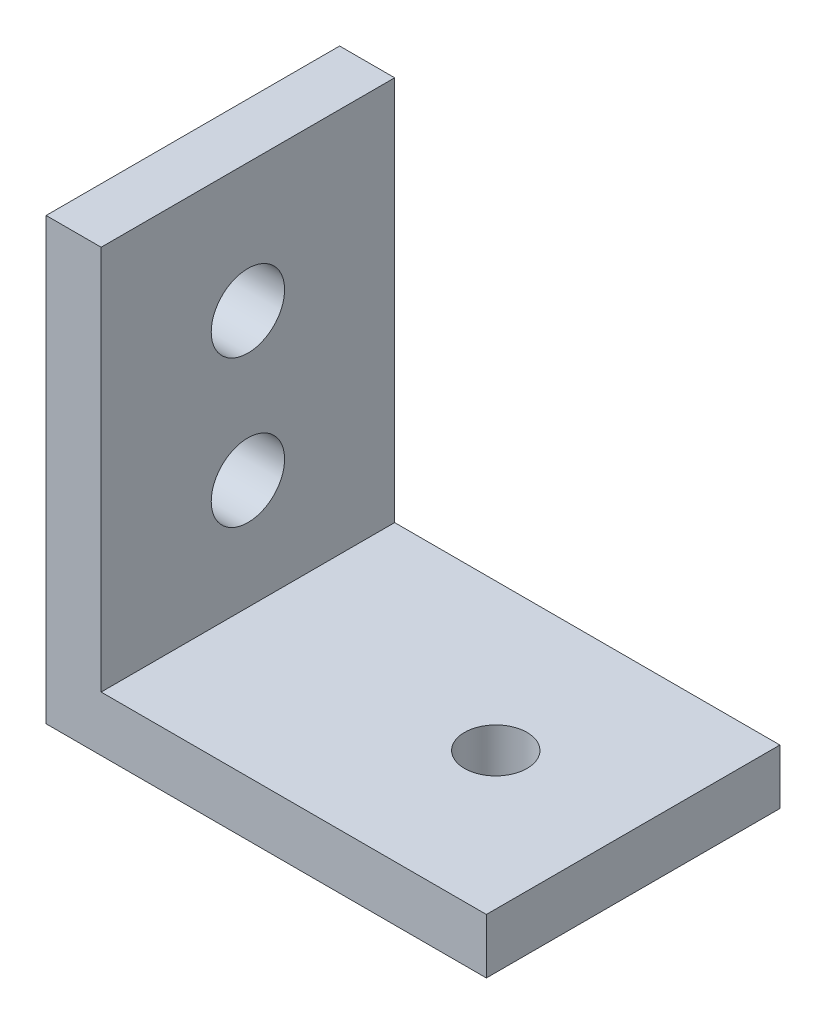
ISO-10303-21;
HEADER;
FILE_DESCRIPTION(('STEP AP214'),'2;1');
FILE_NAME('part.step','',(''),(''),'','','');
FILE_SCHEMA(('AUTOMOTIVE_DESIGN { 1 0 10303 214 1 1 1 1 }'));
ENDSEC;
DATA;
#1=APPLICATION_CONTEXT('core data for automotive mechanical design processes');
#2=APPLICATION_PROTOCOL_DEFINITION('international standard','automotive_design',2000,#1);
#3=PRODUCT_CONTEXT('',#1,'mechanical');
#4=PRODUCT('Part','Part','',(#3));
#5=PRODUCT_RELATED_PRODUCT_CATEGORY('part','',(#4));
#6=PRODUCT_DEFINITION_FORMATION('','',#4);
#7=PRODUCT_DEFINITION_CONTEXT('part definition',#1,'design');
#8=PRODUCT_DEFINITION('design','',#6,#7);
#9=PRODUCT_DEFINITION_SHAPE('','',#8);
#10=(LENGTH_UNIT() NAMED_UNIT(*) SI_UNIT(.MILLI.,.METRE.));
#11=(NAMED_UNIT(*) PLANE_ANGLE_UNIT() SI_UNIT($,.RADIAN.));
#12=(NAMED_UNIT(*) SI_UNIT($,.STERADIAN.) SOLID_ANGLE_UNIT());
#13=UNCERTAINTY_MEASURE_WITH_UNIT(LENGTH_MEASURE(1.E-05),#10,'distance_accuracy_value','');
#14=(GEOMETRIC_REPRESENTATION_CONTEXT(3) GLOBAL_UNCERTAINTY_ASSIGNED_CONTEXT((#13)) GLOBAL_UNIT_ASSIGNED_CONTEXT((#10,
#11,#12)) REPRESENTATION_CONTEXT('',''));
#15=CARTESIAN_POINT('',(0.,0.,0.));
#16=DIRECTION('',(0.,0.,1.));
#17=DIRECTION('',(1.,0.,0.));
#18=AXIS2_PLACEMENT_3D('',#15,#16,#17);
#19=CARTESIAN_POINT('',(-23.7711210122605,18.9432730665901,25.4));
#20=DIRECTION('',(0.,-1.,0.));
#21=DIRECTION('',(0.,0.,-1.));
#22=AXIS2_PLACEMENT_3D('',#19,#20,#21);
#23=PLANE('',#22);
#24=DIRECTION('',(-1.,0.,0.));
#25=VECTOR('',#24,1.);
#26=CARTESIAN_POINT('',(-23.7711210122605,18.9432730665901,0.));
#27=LINE('',#26,#25);
#28=CARTESIAN_POINT('',(-19.0086210122605,18.9432730665901,0.));
#29=VERTEX_POINT('',#28);
#30=CARTESIAN_POINT('',(-23.7711210122605,18.9432730665901,0.));
#31=VERTEX_POINT('',#30);
#32=EDGE_CURVE('E119',#29,#31,#27,.T.);
#33=ORIENTED_EDGE('',*,*,#32,.T.);
#34=DIRECTION('',(0.,0.,-1.));
#35=VECTOR('',#34,1.);
#36=CARTESIAN_POINT('',(-23.7711210122605,18.9432730665901,25.4));
#37=LINE('',#36,#35);
#38=CARTESIAN_POINT('',(-23.7711210122605,18.9432730665901,25.4));
#39=VERTEX_POINT('',#38);
#40=EDGE_CURVE('E11',#39,#31,#37,.T.);
#41=ORIENTED_EDGE('',*,*,#40,.F.);
#42=DIRECTION('',(-1.,0.,0.));
#43=VECTOR('',#42,1.);
#44=CARTESIAN_POINT('',(-23.7711210122605,18.9432730665901,25.4));
#45=LINE('',#44,#43);
#46=CARTESIAN_POINT('',(-19.0086210122605,18.9432730665901,25.4));
#47=VERTEX_POINT('',#46);
#48=EDGE_CURVE('E130',#47,#39,#45,.T.);
#49=ORIENTED_EDGE('',*,*,#48,.F.);
#50=DIRECTION('',(0.,0.,-1.));
#51=VECTOR('',#50,1.);
#52=CARTESIAN_POINT('',(-19.0086210122605,18.9432730665901,25.4));
#53=LINE('',#52,#51);
#54=EDGE_CURVE('E115',#47,#29,#53,.T.);
#55=ORIENTED_EDGE('',*,*,#54,.T.);
#56=EDGE_LOOP('',(#33,#41,#49,#55));
#57=FACE_BOUND('',#56,.T.);
#58=ADVANCED_FACE('F35',(#57),#23,.F.);
#59=CARTESIAN_POINT('',(-23.7711210122605,18.9432730665901,25.4));
#60=DIRECTION('',(1.,0.,0.));
#61=DIRECTION('',(0.,1.,0.));
#62=AXIS2_PLACEMENT_3D('',#59,#60,#61);
#63=PLANE('',#62);
#64=CARTESIAN_POINT('',(-23.7711210122605,-4.86922693340992,12.7));
#65=DIRECTION('',(-1.,0.,0.));
#66=DIRECTION('',(0.,-1.,0.));
#67=AXIS2_PLACEMENT_3D('',#64,#65,#66);
#68=CIRCLE('',#67,3.175);
#69=CARTESIAN_POINT('',(-23.7711210122605,-8.04422693340992,12.7));
#70=VERTEX_POINT('',#69);
#71=EDGE_CURVE('E242',#70,#70,#68,.T.);
#72=ORIENTED_EDGE('',*,*,#71,.F.);
#73=EDGE_LOOP('',(#72));
#74=FACE_BOUND('',#73,.T.);
#75=CARTESIAN_POINT('',(-23.7711210122605,7.83077306659008,12.7));
#76=DIRECTION('',(-1.,0.,0.));
#77=DIRECTION('',(0.,-1.,0.));
#78=AXIS2_PLACEMENT_3D('',#75,#76,#77);
#79=CIRCLE('',#78,3.175);
#80=CARTESIAN_POINT('',(-23.7711210122605,4.65577306659007,12.7));
#81=VERTEX_POINT('',#80);
#82=EDGE_CURVE('E250',#81,#81,#79,.T.);
#83=ORIENTED_EDGE('',*,*,#82,.F.);
#84=EDGE_LOOP('',(#83));
#85=FACE_BOUND('',#84,.T.);
#86=DIRECTION('',(0.,-1.,0.));
#87=VECTOR('',#86,1.);
#88=CARTESIAN_POINT('',(-23.7711210122605,18.9432730665901,0.));
#89=LINE('',#88,#87);
#90=CARTESIAN_POINT('',(-23.7711210122605,-19.1567269334099,0.));
#91=VERTEX_POINT('',#90);
#92=EDGE_CURVE('E122',#31,#91,#89,.T.);
#93=ORIENTED_EDGE('',*,*,#92,.T.);
#94=DIRECTION('',(0.,0.,-1.));
#95=VECTOR('',#94,1.);
#96=CARTESIAN_POINT('',(-23.7711210122605,-19.1567269334099,25.4));
#97=LINE('',#96,#95);
#98=CARTESIAN_POINT('',(-23.7711210122605,-19.1567269334099,25.4));
#99=VERTEX_POINT('',#98);
#100=EDGE_CURVE('E43',#99,#91,#97,.T.);
#101=ORIENTED_EDGE('',*,*,#100,.F.);
#102=DIRECTION('',(0.,-1.,0.));
#103=VECTOR('',#102,1.);
#104=CARTESIAN_POINT('',(-23.7711210122605,18.9432730665901,25.4));
#105=LINE('',#104,#103);
#106=EDGE_CURVE('E88',#39,#99,#105,.T.);
#107=ORIENTED_EDGE('',*,*,#106,.F.);
#108=ORIENTED_EDGE('',*,*,#40,.T.);
#109=EDGE_LOOP('',(#93,#101,#107,#108));
#110=FACE_BOUND('',#109,.T.);
#111=ADVANCED_FACE('F160',(#74,#85,#110),#63,.F.);
#112=CARTESIAN_POINT('',(-23.7711210122605,-19.1567269334099,25.4));
#113=DIRECTION('',(0.,1.,0.));
#114=DIRECTION('',(0.,0.,1.));
#115=AXIS2_PLACEMENT_3D('',#112,#113,#114);
#116=PLANE('',#115);
#117=CARTESIAN_POINT('',(2.44167898773952,-19.1567269334099,12.7));
#118=DIRECTION('',(0.,-1.,0.));
#119=DIRECTION('',(0.,0.,-1.));
#120=AXIS2_PLACEMENT_3D('',#117,#118,#119);
#121=CIRCLE('',#120,2.7051);
#122=CARTESIAN_POINT('',(2.44167898773952,-19.1567269334099,9.9949));
#123=VERTEX_POINT('',#122);
#124=EDGE_CURVE('E240',#123,#123,#121,.T.);
#125=ORIENTED_EDGE('',*,*,#124,.F.);
#126=EDGE_LOOP('',(#125));
#127=FACE_BOUND('',#126,.T.);
#128=DIRECTION('',(1.,0.,0.));
#129=VECTOR('',#128,1.);
#130=CARTESIAN_POINT('',(-23.7711210122605,-19.1567269334099,0.));
#131=LINE('',#130,#129);
#132=CARTESIAN_POINT('',(14.3288789877395,-19.1567269334099,0.));
#133=VERTEX_POINT('',#132);
#134=EDGE_CURVE('E125',#91,#133,#131,.T.);
#135=ORIENTED_EDGE('',*,*,#134,.T.);
#136=DIRECTION('',(0.,0.,-1.));
#137=VECTOR('',#136,1.);
#138=CARTESIAN_POINT('',(14.3288789877395,-19.1567269334099,25.4));
#139=LINE('',#138,#137);
#140=CARTESIAN_POINT('',(14.3288789877395,-19.1567269334099,25.4));
#141=VERTEX_POINT('',#140);
#142=EDGE_CURVE('E110',#141,#133,#139,.T.);
#143=ORIENTED_EDGE('',*,*,#142,.F.);
#144=DIRECTION('',(1.,0.,0.));
#145=VECTOR('',#144,1.);
#146=CARTESIAN_POINT('',(-23.7711210122605,-19.1567269334099,25.4));
#147=LINE('',#146,#145);
#148=EDGE_CURVE('E101',#99,#141,#147,.T.);
#149=ORIENTED_EDGE('',*,*,#148,.F.);
#150=ORIENTED_EDGE('',*,*,#100,.T.);
#151=EDGE_LOOP('',(#135,#143,#149,#150));
#152=FACE_BOUND('',#151,.T.);
#153=ADVANCED_FACE('F136',(#127,#152),#116,.F.);
#154=CARTESIAN_POINT('',(14.3288789877395,-14.3942269334099,25.4));
#155=DIRECTION('',(-1.,0.,0.));
#156=DIRECTION('',(0.,0.,1.));
#157=AXIS2_PLACEMENT_3D('',#154,#155,#156);
#158=PLANE('',#157);
#159=DIRECTION('',(0.,1.,0.));
#160=VECTOR('',#159,1.);
#161=CARTESIAN_POINT('',(14.3288789877395,-14.3942269334099,0.));
#162=LINE('',#161,#160);
#163=CARTESIAN_POINT('',(14.3288789877395,-14.3942269334099,0.));
#164=VERTEX_POINT('',#163);
#165=EDGE_CURVE('E109',#133,#164,#162,.T.);
#166=ORIENTED_EDGE('',*,*,#165,.T.);
#167=DIRECTION('',(0.,0.,-1.));
#168=VECTOR('',#167,1.);
#169=CARTESIAN_POINT('',(14.3288789877395,-14.3942269334099,25.4));
#170=LINE('',#169,#168);
#171=CARTESIAN_POINT('',(14.3288789877395,-14.3942269334099,25.4));
#172=VERTEX_POINT('',#171);
#173=EDGE_CURVE('E106',#172,#164,#170,.T.);
#174=ORIENTED_EDGE('',*,*,#173,.F.);
#175=DIRECTION('',(0.,1.,0.));
#176=VECTOR('',#175,1.);
#177=CARTESIAN_POINT('',(14.3288789877395,-14.3942269334099,25.4));
#178=LINE('',#177,#176);
#179=EDGE_CURVE('E95',#141,#172,#178,.T.);
#180=ORIENTED_EDGE('',*,*,#179,.F.);
#181=ORIENTED_EDGE('',*,*,#142,.T.);
#182=EDGE_LOOP('',(#166,#174,#180,#181));
#183=FACE_BOUND('',#182,.T.);
#184=ADVANCED_FACE('F107',(#183),#158,.F.);
#185=CARTESIAN_POINT('',(-19.0086210122605,-14.3942269334099,25.4));
#186=DIRECTION('',(0.,-1.,0.));
#187=DIRECTION('',(0.,0.,-1.));
#188=AXIS2_PLACEMENT_3D('',#185,#186,#187);
#189=PLANE('',#188);
#190=CARTESIAN_POINT('',(2.44167898773952,-14.3942269334099,12.7));
#191=DIRECTION('',(0.,-1.,0.));
#192=DIRECTION('',(0.,0.,-1.));
#193=AXIS2_PLACEMENT_3D('',#190,#191,#192);
#194=CIRCLE('',#193,2.7051);
#195=CARTESIAN_POINT('',(2.44167898773952,-14.3942269334099,9.9949));
#196=VERTEX_POINT('',#195);
#197=EDGE_CURVE('E237',#196,#196,#194,.T.);
#198=ORIENTED_EDGE('',*,*,#197,.T.);
#199=EDGE_LOOP('',(#198));
#200=FACE_BOUND('',#199,.T.);
#201=DIRECTION('',(-1.,0.,0.));
#202=VECTOR('',#201,1.);
#203=CARTESIAN_POINT('',(-19.0086210122605,-14.3942269334099,0.));
#204=LINE('',#203,#202);
#205=CARTESIAN_POINT('',(-19.0086210122605,-14.3942269334099,0.));
#206=VERTEX_POINT('',#205);
#207=EDGE_CURVE('E74',#164,#206,#204,.T.);
#208=ORIENTED_EDGE('',*,*,#207,.T.);
#209=DIRECTION('',(0.,0.,-1.));
#210=VECTOR('',#209,1.);
#211=CARTESIAN_POINT('',(-19.0086210122605,-14.3942269334099,25.4));
#212=LINE('',#211,#210);
#213=CARTESIAN_POINT('',(-19.0086210122605,-14.3942269334099,25.4));
#214=VERTEX_POINT('',#213);
#215=EDGE_CURVE('E111',#214,#206,#212,.T.);
#216=ORIENTED_EDGE('',*,*,#215,.F.);
#217=DIRECTION('',(-1.,0.,0.));
#218=VECTOR('',#217,1.);
#219=CARTESIAN_POINT('',(-19.0086210122605,-14.3942269334099,25.4));
#220=LINE('',#219,#218);
#221=EDGE_CURVE('E99',#172,#214,#220,.T.);
#222=ORIENTED_EDGE('',*,*,#221,.F.);
#223=ORIENTED_EDGE('',*,*,#173,.T.);
#224=EDGE_LOOP('',(#208,#216,#222,#223));
#225=FACE_BOUND('',#224,.T.);
#226=ADVANCED_FACE('F113',(#200,#225),#189,.F.);
#227=CARTESIAN_POINT('',(-19.0086210122605,18.9432730665901,25.4));
#228=DIRECTION('',(-1.,0.,0.));
#229=DIRECTION('',(0.,0.,1.));
#230=AXIS2_PLACEMENT_3D('',#227,#228,#229);
#231=PLANE('',#230);
#232=CARTESIAN_POINT('',(-19.0086210122605,-4.86922693340992,12.7));
#233=DIRECTION('',(-1.,0.,0.));
#234=DIRECTION('',(0.,0.,1.));
#235=AXIS2_PLACEMENT_3D('',#232,#233,#234);
#236=CIRCLE('',#235,3.175);
#237=CARTESIAN_POINT('',(-19.0086210122605,-4.86922693340992,15.875));
#238=VERTEX_POINT('',#237);
#239=EDGE_CURVE('E247',#238,#238,#236,.F.);
#240=ORIENTED_EDGE('',*,*,#239,.F.);
#241=EDGE_LOOP('',(#240));
#242=FACE_BOUND('',#241,.T.);
#243=CARTESIAN_POINT('',(-19.0086210122605,7.83077306659008,12.7));
#244=DIRECTION('',(-1.,0.,0.));
#245=DIRECTION('',(0.,0.,1.));
#246=AXIS2_PLACEMENT_3D('',#243,#244,#245);
#247=CIRCLE('',#246,3.175);
#248=CARTESIAN_POINT('',(-19.0086210122605,7.83077306659008,15.875));
#249=VERTEX_POINT('',#248);
#250=EDGE_CURVE('E123',#249,#249,#247,.F.);
#251=ORIENTED_EDGE('',*,*,#250,.F.);
#252=EDGE_LOOP('',(#251));
#253=FACE_BOUND('',#252,.T.);
#254=DIRECTION('',(0.,1.,0.));
#255=VECTOR('',#254,1.);
#256=CARTESIAN_POINT('',(-19.0086210122605,18.9432730665901,0.));
#257=LINE('',#256,#255);
#258=EDGE_CURVE('E80',#206,#29,#257,.T.);
#259=ORIENTED_EDGE('',*,*,#258,.T.);
#260=ORIENTED_EDGE('',*,*,#54,.F.);
#261=DIRECTION('',(0.,1.,0.));
#262=VECTOR('',#261,1.);
#263=CARTESIAN_POINT('',(-19.0086210122605,18.9432730665901,25.4));
#264=LINE('',#263,#262);
#265=EDGE_CURVE('E51',#214,#47,#264,.T.);
#266=ORIENTED_EDGE('',*,*,#265,.F.);
#267=ORIENTED_EDGE('',*,*,#215,.T.);
#268=EDGE_LOOP('',(#259,#260,#266,#267));
#269=FACE_BOUND('',#268,.T.);
#270=ADVANCED_FACE('F143',(#242,#253,#269),#231,.F.);
#271=CARTESIAN_POINT('',(0.,0.,25.4));
#272=DIRECTION('',(0.,0.,-1.));
#273=DIRECTION('',(-1.,0.,0.));
#274=AXIS2_PLACEMENT_3D('',#271,#272,#273);
#275=PLANE('',#274);
#276=ORIENTED_EDGE('',*,*,#48,.T.);
#277=ORIENTED_EDGE('',*,*,#106,.T.);
#278=ORIENTED_EDGE('',*,*,#148,.T.);
#279=ORIENTED_EDGE('',*,*,#179,.T.);
#280=ORIENTED_EDGE('',*,*,#221,.T.);
#281=ORIENTED_EDGE('',*,*,#265,.T.);
#282=EDGE_LOOP('',(#276,#277,#278,#279,#280,#281));
#283=FACE_BOUND('',#282,.T.);
#284=ADVANCED_FACE('F97',(#283),#275,.F.);
#285=CARTESIAN_POINT('',(0.,0.,0.));
#286=DIRECTION('',(0.,0.,-1.));
#287=DIRECTION('',(-1.,0.,0.));
#288=AXIS2_PLACEMENT_3D('',#285,#286,#287);
#289=PLANE('',#288);
#290=ORIENTED_EDGE('',*,*,#32,.F.);
#291=ORIENTED_EDGE('',*,*,#258,.F.);
#292=ORIENTED_EDGE('',*,*,#207,.F.);
#293=ORIENTED_EDGE('',*,*,#165,.F.);
#294=ORIENTED_EDGE('',*,*,#134,.F.);
#295=ORIENTED_EDGE('',*,*,#92,.F.);
#296=EDGE_LOOP('',(#290,#291,#292,#293,#294,#295));
#297=FACE_BOUND('',#296,.T.);
#298=ADVANCED_FACE('F139',(#297),#289,.T.);
#299=CARTESIAN_POINT('',(14.3298789877395,7.83077306659008,12.7));
#300=DIRECTION('',(-1.,0.,0.));
#301=DIRECTION('',(0.,-1.,0.));
#302=AXIS2_PLACEMENT_3D('',#299,#300,#301);
#303=CYLINDRICAL_SURFACE('',#302,3.175);
#304=ORIENTED_EDGE('',*,*,#82,.T.);
#305=EDGE_LOOP('',(#304));
#306=FACE_BOUND('',#305,.T.);
#307=ORIENTED_EDGE('',*,*,#250,.T.);
#308=EDGE_LOOP('',(#307));
#309=FACE_BOUND('',#308,.T.);
#310=ADVANCED_FACE('F199',(#306,#309),#303,.F.);
#311=CARTESIAN_POINT('',(14.3298789877395,-4.86922693340991,12.7));
#312=DIRECTION('',(-1.,0.,0.));
#313=DIRECTION('',(0.,-1.,0.));
#314=AXIS2_PLACEMENT_3D('',#311,#312,#313);
#315=CYLINDRICAL_SURFACE('',#314,3.175);
#316=ORIENTED_EDGE('',*,*,#71,.T.);
#317=EDGE_LOOP('',(#316));
#318=FACE_BOUND('',#317,.T.);
#319=ORIENTED_EDGE('',*,*,#239,.T.);
#320=EDGE_LOOP('',(#319));
#321=FACE_BOUND('',#320,.T.);
#322=ADVANCED_FACE('F204',(#318,#321),#315,.F.);
#323=CARTESIAN_POINT('',(2.44167898773952,-19.1567269334099,12.7));
#324=DIRECTION('',(0.,-1.,0.));
#325=DIRECTION('',(0.,0.,-1.));
#326=AXIS2_PLACEMENT_3D('',#323,#324,#325);
#327=CYLINDRICAL_SURFACE('',#326,2.7051);
#328=ORIENTED_EDGE('',*,*,#197,.F.);
#329=EDGE_LOOP('',(#328));
#330=FACE_BOUND('',#329,.T.);
#331=ORIENTED_EDGE('',*,*,#124,.T.);
#332=EDGE_LOOP('',(#331));
#333=FACE_BOUND('',#332,.T.);
#334=ADVANCED_FACE('F212',(#330,#333),#327,.F.);
#335=CLOSED_SHELL('',(#58,#111,#153,#184,#226,#270,#284,#298,#310,#322,#334));
#336=MANIFOLD_SOLID_BREP('B2',#335);
#337=ADVANCED_BREP_SHAPE_REPRESENTATION('',(#18,#336),#14);
#338=SHAPE_DEFINITION_REPRESENTATION(#9,#337);
ENDSEC;
END-ISO-10303-21;
